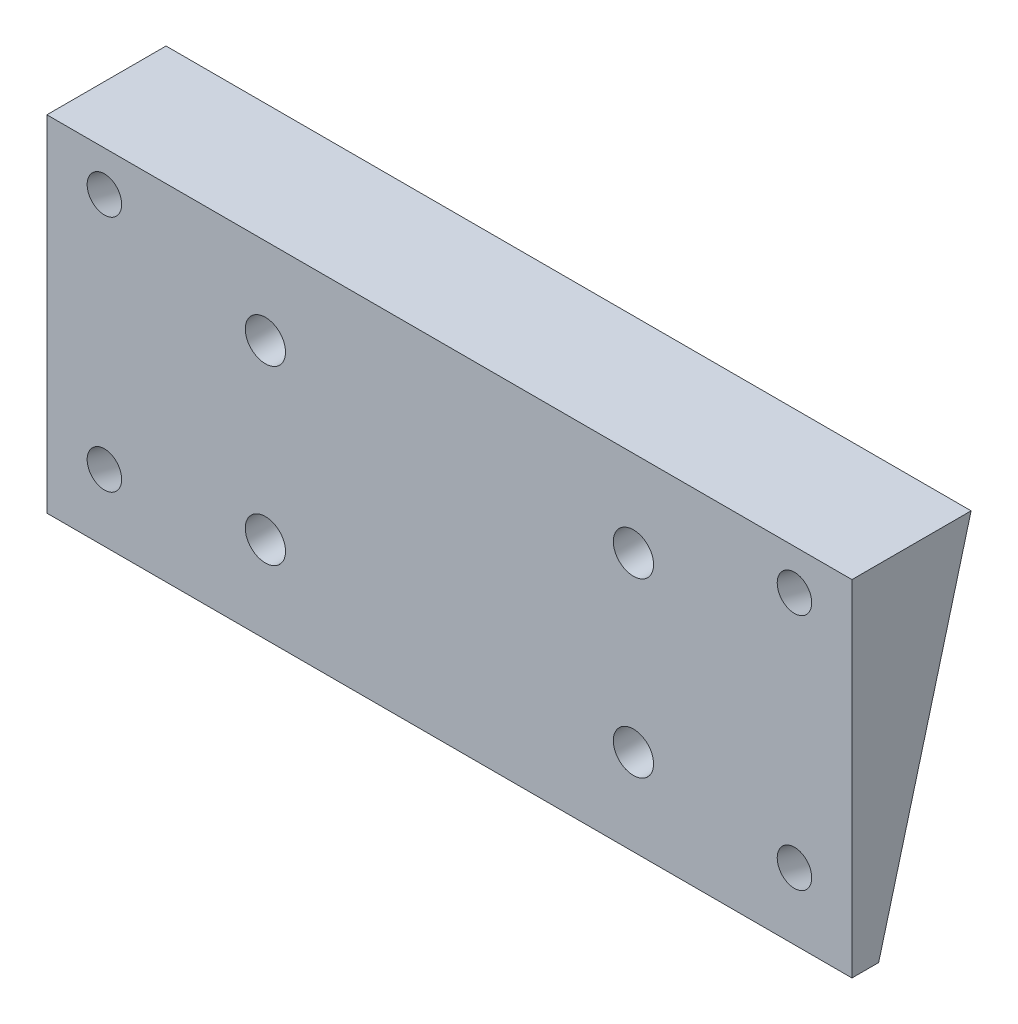
ISO-10303-21;
HEADER;
FILE_DESCRIPTION(('STEP AP214'),'2;1');
FILE_NAME('part.step','',(''),(''),'','','');
FILE_SCHEMA(('AUTOMOTIVE_DESIGN { 1 0 10303 214 1 1 1 1 }'));
ENDSEC;
DATA;
#1=APPLICATION_CONTEXT('core data for automotive mechanical design processes');
#2=APPLICATION_PROTOCOL_DEFINITION('international standard','automotive_design',2000,#1);
#3=PRODUCT_CONTEXT('',#1,'mechanical');
#4=PRODUCT('Part','Part','',(#3));
#5=PRODUCT_RELATED_PRODUCT_CATEGORY('part','',(#4));
#6=PRODUCT_DEFINITION_FORMATION('','',#4);
#7=PRODUCT_DEFINITION_CONTEXT('part definition',#1,'design');
#8=PRODUCT_DEFINITION('design','',#6,#7);
#9=PRODUCT_DEFINITION_SHAPE('','',#8);
#10=(LENGTH_UNIT() NAMED_UNIT(*) SI_UNIT(.MILLI.,.METRE.));
#11=(NAMED_UNIT(*) PLANE_ANGLE_UNIT() SI_UNIT($,.RADIAN.));
#12=(NAMED_UNIT(*) SI_UNIT($,.STERADIAN.) SOLID_ANGLE_UNIT());
#13=UNCERTAINTY_MEASURE_WITH_UNIT(LENGTH_MEASURE(1.E-05),#10,'distance_accuracy_value','');
#14=(GEOMETRIC_REPRESENTATION_CONTEXT(3) GLOBAL_UNCERTAINTY_ASSIGNED_CONTEXT((#13)) GLOBAL_UNIT_ASSIGNED_CONTEXT((#10,
#11,#12)) REPRESENTATION_CONTEXT('',''));
#15=CARTESIAN_POINT('',(0.,0.,0.));
#16=DIRECTION('',(0.,0.,1.));
#17=DIRECTION('',(1.,0.,0.));
#18=AXIS2_PLACEMENT_3D('',#15,#16,#17);
#19=CARTESIAN_POINT('',(74.6410161513773,20.,40.));
#20=DIRECTION('',(0.,-1.,0.));
#21=DIRECTION('',(0.,0.,-1.));
#22=AXIS2_PLACEMENT_3D('',#19,#20,#21);
#23=PLANE('',#22);
#24=DIRECTION('',(-1.,0.,0.));
#25=VECTOR('',#24,1.);
#26=CARTESIAN_POINT('',(44.3910161513773,20.,20.));
#27=LINE('',#26,#25);
#28=CARTESIAN_POINT('',(89.6410161513773,20.,20.));
#29=VERTEX_POINT('',#28);
#30=CARTESIAN_POINT('',(19.6410161513773,20.,20.));
#31=VERTEX_POINT('',#30);
#32=EDGE_CURVE('E11',#29,#31,#27,.T.);
#33=ORIENTED_EDGE('',*,*,#32,.F.);
#34=DIRECTION('',(0.,0.,1.));
#35=VECTOR('',#34,1.);
#36=CARTESIAN_POINT('',(89.6410161513773,20.,9.64101615137753));
#37=LINE('',#36,#35);
#38=CARTESIAN_POINT('',(89.6410161513773,20.,9.64101615137753));
#39=VERTEX_POINT('',#38);
#40=EDGE_CURVE('E103',#39,#29,#37,.T.);
#41=ORIENTED_EDGE('',*,*,#40,.F.);
#42=DIRECTION('',(1.,0.,0.));
#43=VECTOR('',#42,1.);
#44=CARTESIAN_POINT('',(19.6410161513773,20.,9.64101615137753));
#45=LINE('',#44,#43);
#46=CARTESIAN_POINT('',(19.6410161513773,20.,9.64101615137753));
#47=VERTEX_POINT('',#46);
#48=EDGE_CURVE('E42',#47,#39,#45,.T.);
#49=ORIENTED_EDGE('',*,*,#48,.F.);
#50=DIRECTION('',(0.,0.,-1.));
#51=VECTOR('',#50,1.);
#52=CARTESIAN_POINT('',(19.6410161513773,20.,20.));
#53=LINE('',#52,#51);
#54=EDGE_CURVE('E86',#31,#47,#53,.T.);
#55=ORIENTED_EDGE('',*,*,#54,.F.);
#56=EDGE_LOOP('',(#33,#41,#49,#55));
#57=FACE_BOUND('',#56,.T.);
#58=ADVANCED_FACE('F34',(#57),#23,.F.);
#59=CARTESIAN_POINT('',(0.,0.,20.));
#60=DIRECTION('',(0.,0.,-1.));
#61=DIRECTION('',(-1.,0.,0.));
#62=AXIS2_PLACEMENT_3D('',#59,#60,#61);
#63=PLANE('',#62);
#64=CARTESIAN_POINT('',(84.6410161513763,16.5036827751608,20.));
#65=DIRECTION('',(0.,0.,-1.));
#66=DIRECTION('',(0.,-1.,0.));
#67=AXIS2_PLACEMENT_3D('',#64,#65,#66);
#68=ELLIPSE('',#67,1.55291427061511,1.49999999999998);
#69=CARTESIAN_POINT('',(84.6410161513763,14.9507685045457,20.));
#70=VERTEX_POINT('',#69);
#71=EDGE_CURVE('E94',#70,#70,#68,.T.);
#72=ORIENTED_EDGE('',*,*,#71,.T.);
#73=EDGE_LOOP('',(#72));
#74=FACE_BOUND('',#73,.T.);
#75=CARTESIAN_POINT('',(24.6410161513763,-4.20184083304089,20.));
#76=DIRECTION('',(0.,0.,-1.));
#77=DIRECTION('',(0.,-1.,0.));
#78=AXIS2_PLACEMENT_3D('',#75,#76,#77);
#79=ELLIPSE('',#78,1.55291427061512,1.49999999999999);
#80=CARTESIAN_POINT('',(24.6410161513763,-5.75475510365601,20.));
#81=VERTEX_POINT('',#80);
#82=EDGE_CURVE('E97',#81,#81,#79,.T.);
#83=ORIENTED_EDGE('',*,*,#82,.T.);
#84=EDGE_LOOP('',(#83));
#85=FACE_BOUND('',#84,.T.);
#86=CARTESIAN_POINT('',(24.6410161513763,16.5036827751608,20.));
#87=DIRECTION('',(0.,0.,-1.));
#88=DIRECTION('',(0.,-1.,0.));
#89=AXIS2_PLACEMENT_3D('',#86,#87,#88);
#90=ELLIPSE('',#89,1.55291427061512,1.49999999999999);
#91=CARTESIAN_POINT('',(24.6410161513763,14.9507685045457,20.));
#92=VERTEX_POINT('',#91);
#93=EDGE_CURVE('E212',#92,#92,#90,.T.);
#94=ORIENTED_EDGE('',*,*,#93,.T.);
#95=EDGE_LOOP('',(#94));
#96=FACE_BOUND('',#95,.T.);
#97=CARTESIAN_POINT('',(84.6410161513763,-4.20184083304089,20.));
#98=DIRECTION('',(0.,0.,-1.));
#99=DIRECTION('',(0.,-1.,0.));
#100=AXIS2_PLACEMENT_3D('',#97,#98,#99);
#101=ELLIPSE('',#100,1.55291427061512,1.5);
#102=CARTESIAN_POINT('',(84.6410161513763,-5.75475510365601,20.));
#103=VERTEX_POINT('',#102);
#104=EDGE_CURVE('E214',#103,#103,#101,.T.);
#105=ORIENTED_EDGE('',*,*,#104,.T.);
#106=EDGE_LOOP('',(#105));
#107=FACE_BOUND('',#106,.T.);
#108=CARTESIAN_POINT('',(38.6410161513773,-2.49999999999999,20.));
#109=DIRECTION('',(0.,0.,1.));
#110=DIRECTION('',(1.,0.,0.));
#111=AXIS2_PLACEMENT_3D('',#108,#109,#110);
#112=CIRCLE('',#111,1.75);
#113=CARTESIAN_POINT('',(40.3910161513773,-2.49999999999999,20.));
#114=VERTEX_POINT('',#113);
#115=EDGE_CURVE('E110',#114,#114,#112,.T.);
#116=ORIENTED_EDGE('',*,*,#115,.F.);
#117=EDGE_LOOP('',(#116));
#118=FACE_BOUND('',#117,.T.);
#119=CARTESIAN_POINT('',(70.6410161513773,-2.49999999999999,20.));
#120=DIRECTION('',(0.,0.,1.));
#121=DIRECTION('',(1.,0.,0.));
#122=AXIS2_PLACEMENT_3D('',#119,#120,#121);
#123=CIRCLE('',#122,1.75);
#124=CARTESIAN_POINT('',(72.3910161513773,-2.49999999999999,20.));
#125=VERTEX_POINT('',#124);
#126=EDGE_CURVE('E115',#125,#125,#123,.T.);
#127=ORIENTED_EDGE('',*,*,#126,.F.);
#128=EDGE_LOOP('',(#127));
#129=FACE_BOUND('',#128,.T.);
#130=CARTESIAN_POINT('',(70.6410161513773,12.5,20.));
#131=DIRECTION('',(0.,0.,1.));
#132=DIRECTION('',(1.,0.,0.));
#133=AXIS2_PLACEMENT_3D('',#130,#131,#132);
#134=CIRCLE('',#133,1.75);
#135=CARTESIAN_POINT('',(72.3910161513773,12.5,20.));
#136=VERTEX_POINT('',#135);
#137=EDGE_CURVE('E111',#136,#136,#134,.T.);
#138=ORIENTED_EDGE('',*,*,#137,.F.);
#139=EDGE_LOOP('',(#138));
#140=FACE_BOUND('',#139,.T.);
#141=CARTESIAN_POINT('',(38.6410161513773,12.5,20.));
#142=DIRECTION('',(0.,0.,1.));
#143=DIRECTION('',(1.,0.,0.));
#144=AXIS2_PLACEMENT_3D('',#141,#142,#143);
#145=CIRCLE('',#144,1.75);
#146=CARTESIAN_POINT('',(40.3910161513773,12.5,20.));
#147=VERTEX_POINT('',#146);
#148=EDGE_CURVE('E114',#147,#147,#145,.T.);
#149=ORIENTED_EDGE('',*,*,#148,.F.);
#150=EDGE_LOOP('',(#149));
#151=FACE_BOUND('',#150,.T.);
#152=ORIENTED_EDGE('',*,*,#32,.T.);
#153=DIRECTION('',(0.,1.,0.));
#154=VECTOR('',#153,1.);
#155=CARTESIAN_POINT('',(19.6410161513773,-10.,20.));
#156=LINE('',#155,#154);
#157=CARTESIAN_POINT('',(19.6410161513773,-10.,20.));
#158=VERTEX_POINT('',#157);
#159=EDGE_CURVE('E79',#158,#31,#156,.T.);
#160=ORIENTED_EDGE('',*,*,#159,.F.);
#161=DIRECTION('',(-1.,0.,0.));
#162=VECTOR('',#161,1.);
#163=CARTESIAN_POINT('',(74.6410161513773,-9.99999999999997,20.));
#164=LINE('',#163,#162);
#165=CARTESIAN_POINT('',(89.6410161513773,-9.99999999999997,20.));
#166=VERTEX_POINT('',#165);
#167=EDGE_CURVE('E123',#166,#158,#164,.T.);
#168=ORIENTED_EDGE('',*,*,#167,.F.);
#169=DIRECTION('',(0.,-1.,0.));
#170=VECTOR('',#169,1.);
#171=CARTESIAN_POINT('',(89.6410161513773,20.,20.));
#172=LINE('',#171,#170);
#173=EDGE_CURVE('E81',#29,#166,#172,.T.);
#174=ORIENTED_EDGE('',*,*,#173,.F.);
#175=EDGE_LOOP('',(#152,#160,#168,#174));
#176=FACE_BOUND('',#175,.T.);
#177=ADVANCED_FACE('F77',(#74,#85,#96,#107,#118,#129,#140,#151,#176),#63,.F.);
#178=CARTESIAN_POINT('',(19.6410161513773,0.,15.));
#179=DIRECTION('',(0.,0.258819045102521,0.965925826289068));
#180=DIRECTION('',(0.,-0.965925826289068,0.258819045102521));
#181=AXIS2_PLACEMENT_3D('',#178,#179,#180);
#182=PLANE('',#181);
#183=CARTESIAN_POINT('',(84.6410161513763,14.1481456572248,11.2090157967487));
#184=DIRECTION('',(0.,-0.258819045102521,-0.965925826289068));
#185=DIRECTION('',(0.,0.965925826289068,-0.258819045102521));
#186=AXIS2_PLACEMENT_3D('',#183,#184,#185);
#187=CIRCLE('',#186,1.49999999999998);
#188=CARTESIAN_POINT('',(84.6410161513763,15.5970343966584,10.8207872290949));
#189=VERTEX_POINT('',#188);
#190=EDGE_CURVE('E223',#189,#189,#187,.T.);
#191=ORIENTED_EDGE('',*,*,#190,.F.);
#192=EDGE_LOOP('',(#191));
#193=FACE_BOUND('',#192,.T.);
#194=CARTESIAN_POINT('',(24.6410161513763,-5.17037086855654,16.3853966987991));
#195=DIRECTION('',(0.,-0.258819045102521,-0.965925826289068));
#196=DIRECTION('',(0.,0.965925826289068,-0.258819045102521));
#197=AXIS2_PLACEMENT_3D('',#194,#195,#196);
#198=CIRCLE('',#197,1.49999999999999);
#199=CARTESIAN_POINT('',(24.6410161513763,-3.72148212912294,15.9971681311454));
#200=VERTEX_POINT('',#199);
#201=EDGE_CURVE('E224',#200,#200,#198,.T.);
#202=ORIENTED_EDGE('',*,*,#201,.F.);
#203=EDGE_LOOP('',(#202));
#204=FACE_BOUND('',#203,.T.);
#205=CARTESIAN_POINT('',(24.6410161513763,14.1481456572248,11.2090157967487));
#206=DIRECTION('',(0.,-0.258819045102521,-0.965925826289068));
#207=DIRECTION('',(0.,0.965925826289068,-0.258819045102521));
#208=AXIS2_PLACEMENT_3D('',#205,#206,#207);
#209=CIRCLE('',#208,1.49999999999999);
#210=CARTESIAN_POINT('',(24.6410161513763,15.5970343966584,10.8207872290949));
#211=VERTEX_POINT('',#210);
#212=EDGE_CURVE('E209',#211,#211,#209,.T.);
#213=ORIENTED_EDGE('',*,*,#212,.F.);
#214=EDGE_LOOP('',(#213));
#215=FACE_BOUND('',#214,.T.);
#216=CARTESIAN_POINT('',(84.6410161513763,-5.17037086855653,16.3853966987991));
#217=DIRECTION('',(0.,-0.258819045102521,-0.965925826289068));
#218=DIRECTION('',(0.,0.965925826289068,-0.258819045102521));
#219=AXIS2_PLACEMENT_3D('',#216,#217,#218);
#220=CIRCLE('',#219,1.5);
#221=CARTESIAN_POINT('',(84.6410161513763,-3.72148212912293,15.9971681311454));
#222=VERTEX_POINT('',#221);
#223=EDGE_CURVE('E218',#222,#222,#220,.T.);
#224=ORIENTED_EDGE('',*,*,#223,.F.);
#225=EDGE_LOOP('',(#224));
#226=FACE_BOUND('',#225,.T.);
#227=CARTESIAN_POINT('',(38.6410161513773,-2.49999999999999,15.6698729810778));
#228=DIRECTION('',(0.,0.258819045102521,0.965925826289068));
#229=DIRECTION('',(0.,-0.965925826289068,0.258819045102521));
#230=AXIS2_PLACEMENT_3D('',#227,#228,#229);
#231=ELLIPSE('',#230,1.81173331571765,1.75);
#232=CARTESIAN_POINT('',(38.6410161513773,-4.24999999999999,16.1387840678323));
#233=VERTEX_POINT('',#232);
#234=EDGE_CURVE('E37',#233,#233,#231,.T.);
#235=ORIENTED_EDGE('',*,*,#234,.T.);
#236=EDGE_LOOP('',(#235));
#237=FACE_BOUND('',#236,.T.);
#238=CARTESIAN_POINT('',(70.6410161513773,-2.49999999999999,15.6698729810778));
#239=DIRECTION('',(0.,0.258819045102521,0.965925826289068));
#240=DIRECTION('',(0.,-0.965925826289068,0.258819045102521));
#241=AXIS2_PLACEMENT_3D('',#238,#239,#240);
#242=ELLIPSE('',#241,1.81173331571764,1.75);
#243=CARTESIAN_POINT('',(70.6410161513773,-4.24999999999999,16.1387840678323));
#244=VERTEX_POINT('',#243);
#245=EDGE_CURVE('E131',#244,#244,#242,.T.);
#246=ORIENTED_EDGE('',*,*,#245,.T.);
#247=EDGE_LOOP('',(#246));
#248=FACE_BOUND('',#247,.T.);
#249=CARTESIAN_POINT('',(70.6410161513773,12.5,11.650635094611));
#250=DIRECTION('',(0.,0.258819045102521,0.965925826289068));
#251=DIRECTION('',(0.,-0.965925826289068,0.258819045102521));
#252=AXIS2_PLACEMENT_3D('',#249,#250,#251);
#253=ELLIPSE('',#252,1.81173331571764,1.75);
#254=CARTESIAN_POINT('',(70.6410161513773,10.75,12.1195461813654));
#255=VERTEX_POINT('',#254);
#256=EDGE_CURVE('E129',#255,#255,#253,.T.);
#257=ORIENTED_EDGE('',*,*,#256,.T.);
#258=EDGE_LOOP('',(#257));
#259=FACE_BOUND('',#258,.T.);
#260=CARTESIAN_POINT('',(38.6410161513773,12.5,11.650635094611));
#261=DIRECTION('',(0.,0.258819045102521,0.965925826289068));
#262=DIRECTION('',(0.,-0.965925826289068,0.258819045102521));
#263=AXIS2_PLACEMENT_3D('',#260,#261,#262);
#264=ELLIPSE('',#263,1.81173331571765,1.75);
#265=CARTESIAN_POINT('',(38.6410161513773,10.75,12.1195461813654));
#266=VERTEX_POINT('',#265);
#267=EDGE_CURVE('E122',#266,#266,#264,.T.);
#268=ORIENTED_EDGE('',*,*,#267,.T.);
#269=EDGE_LOOP('',(#268));
#270=FACE_BOUND('',#269,.T.);
#271=ORIENTED_EDGE('',*,*,#48,.T.);
#272=DIRECTION('',(0.,0.965925826289068,-0.258819045102522));
#273=VECTOR('',#272,1.);
#274=CARTESIAN_POINT('',(89.6410161513773,-9.99999999999997,17.6794919243112));
#275=LINE('',#274,#273);
#276=CARTESIAN_POINT('',(89.6410161513773,-9.99999999999997,17.6794919243112));
#277=VERTEX_POINT('',#276);
#278=EDGE_CURVE('E108',#277,#39,#275,.T.);
#279=ORIENTED_EDGE('',*,*,#278,.F.);
#280=DIRECTION('',(-1.,0.,0.));
#281=VECTOR('',#280,1.);
#282=CARTESIAN_POINT('',(74.6410161513773,-9.99999999999997,17.6794919243112));
#283=LINE('',#282,#281);
#284=CARTESIAN_POINT('',(19.6410161513773,-10.,17.6794919243112));
#285=VERTEX_POINT('',#284);
#286=EDGE_CURVE('E57',#277,#285,#283,.T.);
#287=ORIENTED_EDGE('',*,*,#286,.T.);
#288=DIRECTION('',(0.,-0.965925826289068,0.258819045102521));
#289=VECTOR('',#288,1.);
#290=CARTESIAN_POINT('',(19.6410161513773,20.,9.64101615137753));
#291=LINE('',#290,#289);
#292=EDGE_CURVE('E89',#47,#285,#291,.T.);
#293=ORIENTED_EDGE('',*,*,#292,.F.);
#294=EDGE_LOOP('',(#271,#279,#287,#293));
#295=FACE_BOUND('',#294,.T.);
#296=ADVANCED_FACE('F138',(#193,#204,#215,#226,#237,#248,#259,#270,#295),#182,.F.);
#297=CARTESIAN_POINT('',(74.6410161513773,-9.99999999999997,17.6794919243112));
#298=DIRECTION('',(0.,-1.,0.));
#299=DIRECTION('',(1.,0.,0.));
#300=AXIS2_PLACEMENT_3D('',#297,#298,#299);
#301=PLANE('',#300);
#302=ORIENTED_EDGE('',*,*,#167,.T.);
#303=DIRECTION('',(0.,0.,1.));
#304=VECTOR('',#303,1.);
#305=CARTESIAN_POINT('',(19.6410161513773,-10.,17.6794919243112));
#306=LINE('',#305,#304);
#307=EDGE_CURVE('E93',#285,#158,#306,.T.);
#308=ORIENTED_EDGE('',*,*,#307,.F.);
#309=ORIENTED_EDGE('',*,*,#286,.F.);
#310=DIRECTION('',(0.,0.,-1.));
#311=VECTOR('',#310,1.);
#312=CARTESIAN_POINT('',(89.6410161513773,-9.99999999999997,20.));
#313=LINE('',#312,#311);
#314=EDGE_CURVE('E106',#166,#277,#313,.T.);
#315=ORIENTED_EDGE('',*,*,#314,.F.);
#316=EDGE_LOOP('',(#302,#308,#309,#315));
#317=FACE_BOUND('',#316,.T.);
#318=ADVANCED_FACE('F164',(#317),#301,.T.);
#319=CARTESIAN_POINT('',(38.6410161513773,12.5,10.));
#320=DIRECTION('',(0.,0.,1.));
#321=DIRECTION('',(1.,0.,0.));
#322=AXIS2_PLACEMENT_3D('',#319,#320,#321);
#323=CYLINDRICAL_SURFACE('',#322,1.75);
#324=ORIENTED_EDGE('',*,*,#148,.T.);
#325=EDGE_LOOP('',(#324));
#326=FACE_BOUND('',#325,.T.);
#327=ORIENTED_EDGE('',*,*,#267,.F.);
#328=EDGE_LOOP('',(#327));
#329=FACE_BOUND('',#328,.T.);
#330=ADVANCED_FACE('F170',(#326,#329),#323,.F.);
#331=CARTESIAN_POINT('',(70.6410161513773,12.5,10.));
#332=DIRECTION('',(0.,0.,1.));
#333=DIRECTION('',(1.,0.,0.));
#334=AXIS2_PLACEMENT_3D('',#331,#332,#333);
#335=CYLINDRICAL_SURFACE('',#334,1.75);
#336=ORIENTED_EDGE('',*,*,#137,.T.);
#337=EDGE_LOOP('',(#336));
#338=FACE_BOUND('',#337,.T.);
#339=ORIENTED_EDGE('',*,*,#256,.F.);
#340=EDGE_LOOP('',(#339));
#341=FACE_BOUND('',#340,.T.);
#342=ADVANCED_FACE('F152',(#338,#341),#335,.F.);
#343=CARTESIAN_POINT('',(70.6410161513773,-2.49999999999999,10.));
#344=DIRECTION('',(0.,0.,1.));
#345=DIRECTION('',(1.,0.,0.));
#346=AXIS2_PLACEMENT_3D('',#343,#344,#345);
#347=CYLINDRICAL_SURFACE('',#346,1.75);
#348=ORIENTED_EDGE('',*,*,#126,.T.);
#349=EDGE_LOOP('',(#348));
#350=FACE_BOUND('',#349,.T.);
#351=ORIENTED_EDGE('',*,*,#245,.F.);
#352=EDGE_LOOP('',(#351));
#353=FACE_BOUND('',#352,.T.);
#354=ADVANCED_FACE('F143',(#350,#353),#347,.F.);
#355=CARTESIAN_POINT('',(38.6410161513773,-2.49999999999999,10.));
#356=DIRECTION('',(0.,0.,1.));
#357=DIRECTION('',(1.,0.,0.));
#358=AXIS2_PLACEMENT_3D('',#355,#356,#357);
#359=CYLINDRICAL_SURFACE('',#358,1.75);
#360=ORIENTED_EDGE('',*,*,#115,.T.);
#361=EDGE_LOOP('',(#360));
#362=FACE_BOUND('',#361,.T.);
#363=ORIENTED_EDGE('',*,*,#234,.F.);
#364=EDGE_LOOP('',(#363));
#365=FACE_BOUND('',#364,.T.);
#366=ADVANCED_FACE('F140',(#362,#365),#359,.F.);
#367=CARTESIAN_POINT('',(89.6410161513773,0.,0.));
#368=DIRECTION('',(1.,0.,0.));
#369=DIRECTION('',(0.,0.,-1.));
#370=AXIS2_PLACEMENT_3D('',#367,#368,#369);
#371=PLANE('',#370);
#372=ORIENTED_EDGE('',*,*,#40,.T.);
#373=ORIENTED_EDGE('',*,*,#173,.T.);
#374=ORIENTED_EDGE('',*,*,#314,.T.);
#375=ORIENTED_EDGE('',*,*,#278,.T.);
#376=EDGE_LOOP('',(#372,#373,#374,#375));
#377=FACE_BOUND('',#376,.T.);
#378=ADVANCED_FACE('F142',(#377),#371,.T.);
#379=CARTESIAN_POINT('',(19.6410161513773,0.,0.));
#380=DIRECTION('',(-1.,0.,0.));
#381=DIRECTION('',(0.,-1.,0.));
#382=AXIS2_PLACEMENT_3D('',#379,#380,#381);
#383=PLANE('',#382);
#384=ORIENTED_EDGE('',*,*,#159,.T.);
#385=ORIENTED_EDGE('',*,*,#54,.T.);
#386=ORIENTED_EDGE('',*,*,#292,.T.);
#387=ORIENTED_EDGE('',*,*,#307,.T.);
#388=EDGE_LOOP('',(#384,#385,#386,#387));
#389=FACE_BOUND('',#388,.T.);
#390=ADVANCED_FACE('F92',(#389),#383,.T.);
#391=CARTESIAN_POINT('',(84.6410161513763,-2.58218041753132,26.0446549616898));
#392=DIRECTION('',(0.,-0.258819045102521,-0.965925826289068));
#393=DIRECTION('',(0.,0.965925826289068,-0.258819045102521));
#394=AXIS2_PLACEMENT_3D('',#391,#392,#393);
#395=CYLINDRICAL_SURFACE('',#394,1.5);
#396=ORIENTED_EDGE('',*,*,#223,.T.);
#397=EDGE_LOOP('',(#396));
#398=FACE_BOUND('',#397,.T.);
#399=ORIENTED_EDGE('',*,*,#104,.F.);
#400=EDGE_LOOP('',(#399));
#401=FACE_BOUND('',#400,.T.);
#402=ADVANCED_FACE('F189',(#398,#401),#395,.F.);
#403=CARTESIAN_POINT('',(24.6410161513763,16.73633610825,20.8682740596394));
#404=DIRECTION('',(0.,-0.258819045102521,-0.965925826289068));
#405=DIRECTION('',(0.,0.965925826289068,-0.258819045102521));
#406=AXIS2_PLACEMENT_3D('',#403,#404,#405);
#407=CYLINDRICAL_SURFACE('',#406,1.49999999999999);
#408=ORIENTED_EDGE('',*,*,#212,.T.);
#409=EDGE_LOOP('',(#408));
#410=FACE_BOUND('',#409,.T.);
#411=ORIENTED_EDGE('',*,*,#93,.F.);
#412=EDGE_LOOP('',(#411));
#413=FACE_BOUND('',#412,.T.);
#414=ADVANCED_FACE('F192',(#410,#413),#407,.F.);
#415=CARTESIAN_POINT('',(24.6410161513763,-2.58218041753132,26.0446549616898));
#416=DIRECTION('',(0.,-0.258819045102521,-0.965925826289068));
#417=DIRECTION('',(0.,0.965925826289068,-0.258819045102521));
#418=AXIS2_PLACEMENT_3D('',#415,#416,#417);
#419=CYLINDRICAL_SURFACE('',#418,1.49999999999999);
#420=ORIENTED_EDGE('',*,*,#201,.T.);
#421=EDGE_LOOP('',(#420));
#422=FACE_BOUND('',#421,.T.);
#423=ORIENTED_EDGE('',*,*,#82,.F.);
#424=EDGE_LOOP('',(#423));
#425=FACE_BOUND('',#424,.T.);
#426=ADVANCED_FACE('F194',(#422,#425),#419,.F.);
#427=CARTESIAN_POINT('',(84.6410161513763,16.73633610825,20.8682740596394));
#428=DIRECTION('',(0.,-0.258819045102521,-0.965925826289068));
#429=DIRECTION('',(0.,0.965925826289068,-0.258819045102521));
#430=AXIS2_PLACEMENT_3D('',#427,#428,#429);
#431=CYLINDRICAL_SURFACE('',#430,1.49999999999998);
#432=ORIENTED_EDGE('',*,*,#190,.T.);
#433=EDGE_LOOP('',(#432));
#434=FACE_BOUND('',#433,.T.);
#435=ORIENTED_EDGE('',*,*,#71,.F.);
#436=EDGE_LOOP('',(#435));
#437=FACE_BOUND('',#436,.T.);
#438=ADVANCED_FACE('F197',(#434,#437),#431,.F.);
#439=CLOSED_SHELL('',(#58,#177,#296,#318,#330,#342,#354,#366,#378,#390,#402,#414,#426,#438));
#440=MANIFOLD_SOLID_BREP('B2',#439);
#441=ADVANCED_BREP_SHAPE_REPRESENTATION('',(#18,#440),#14);
#442=SHAPE_DEFINITION_REPRESENTATION(#9,#441);
ENDSEC;
END-ISO-10303-21;
